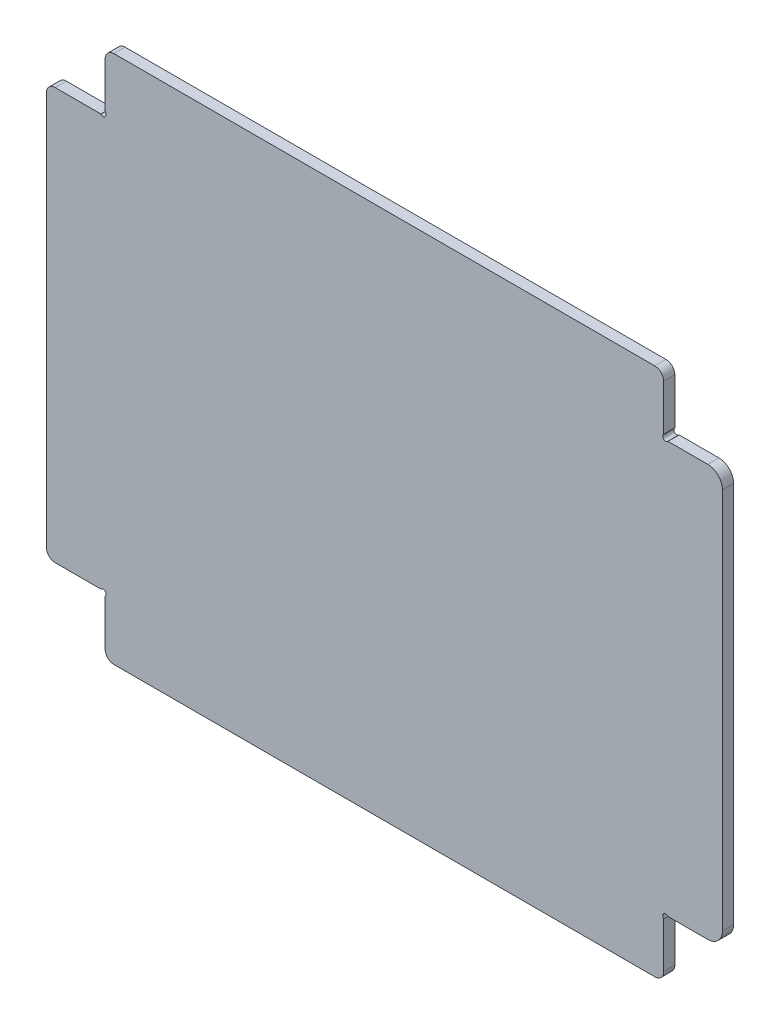
ISO-10303-21;
HEADER;
FILE_DESCRIPTION(('STEP AP214'),'2;1');
FILE_NAME('part.step','',(''),(''),'','','');
FILE_SCHEMA(('AUTOMOTIVE_DESIGN { 1 0 10303 214 1 1 1 1 }'));
ENDSEC;
DATA;
#1=APPLICATION_CONTEXT('core data for automotive mechanical design processes');
#2=APPLICATION_PROTOCOL_DEFINITION('international standard','automotive_design',2000,#1);
#3=PRODUCT_CONTEXT('',#1,'mechanical');
#4=PRODUCT('Part','Part','',(#3));
#5=PRODUCT_RELATED_PRODUCT_CATEGORY('part','',(#4));
#6=PRODUCT_DEFINITION_FORMATION('','',#4);
#7=PRODUCT_DEFINITION_CONTEXT('part definition',#1,'design');
#8=PRODUCT_DEFINITION('design','',#6,#7);
#9=PRODUCT_DEFINITION_SHAPE('','',#8);
#10=(LENGTH_UNIT() NAMED_UNIT(*) SI_UNIT(.MILLI.,.METRE.));
#11=(NAMED_UNIT(*) PLANE_ANGLE_UNIT() SI_UNIT($,.RADIAN.));
#12=(NAMED_UNIT(*) SI_UNIT($,.STERADIAN.) SOLID_ANGLE_UNIT());
#13=UNCERTAINTY_MEASURE_WITH_UNIT(LENGTH_MEASURE(1.E-05),#10,'distance_accuracy_value','');
#14=(GEOMETRIC_REPRESENTATION_CONTEXT(3) GLOBAL_UNCERTAINTY_ASSIGNED_CONTEXT((#13)) GLOBAL_UNIT_ASSIGNED_CONTEXT((#10,
#11,#12)) REPRESENTATION_CONTEXT('',''));
#15=CARTESIAN_POINT('',(0.,0.,0.));
#16=DIRECTION('',(0.,0.,1.));
#17=DIRECTION('',(1.,0.,0.));
#18=AXIS2_PLACEMENT_3D('',#15,#16,#17);
#19=CARTESIAN_POINT('',(-138.752131357152,-64.6460630618817,3.8));
#20=DIRECTION('',(0.,0.,-1.));
#21=DIRECTION('',(-1.,0.,0.));
#22=AXIS2_PLACEMENT_3D('',#19,#20,#21);
#23=CYLINDRICAL_SURFACE('',#22,3.);
#24=CARTESIAN_POINT('',(-138.752131357152,-64.6460630618817,0.));
#25=DIRECTION('',(0.,0.,1.));
#26=DIRECTION('',(1.,0.,0.));
#27=AXIS2_PLACEMENT_3D('',#24,#25,#26);
#28=CIRCLE('',#27,3.);
#29=CARTESIAN_POINT('',(-141.752131357152,-64.6460630618817,0.));
#30=VERTEX_POINT('',#29);
#31=CARTESIAN_POINT('',(-138.752131357152,-67.6460630618816,0.));
#32=VERTEX_POINT('',#31);
#33=EDGE_CURVE('E229',#30,#32,#28,.T.);
#34=ORIENTED_EDGE('',*,*,#33,.T.);
#35=DIRECTION('',(0.,0.,-1.));
#36=VECTOR('',#35,1.);
#37=CARTESIAN_POINT('',(-138.752131357152,-67.6460630618816,3.8));
#38=LINE('',#37,#36);
#39=CARTESIAN_POINT('',(-138.752131357152,-67.6460630618816,3.8));
#40=VERTEX_POINT('',#39);
#41=EDGE_CURVE('E11',#40,#32,#38,.T.);
#42=ORIENTED_EDGE('',*,*,#41,.F.);
#43=CARTESIAN_POINT('',(-138.752131357152,-64.6460630618817,3.8));
#44=DIRECTION('',(0.,0.,1.));
#45=DIRECTION('',(1.,0.,0.));
#46=AXIS2_PLACEMENT_3D('',#43,#44,#45);
#47=CIRCLE('',#46,3.);
#48=CARTESIAN_POINT('',(-141.752131357152,-64.6460630618817,3.8));
#49=VERTEX_POINT('',#48);
#50=EDGE_CURVE('E275',#49,#40,#47,.T.);
#51=ORIENTED_EDGE('',*,*,#50,.F.);
#52=DIRECTION('',(0.,0.,-1.));
#53=VECTOR('',#52,1.);
#54=CARTESIAN_POINT('',(-141.752131357152,-64.6460630618817,3.8));
#55=LINE('',#54,#53);
#56=EDGE_CURVE('E225',#49,#30,#55,.T.);
#57=ORIENTED_EDGE('',*,*,#56,.T.);
#58=EDGE_LOOP('',(#34,#42,#51,#57));
#59=FACE_BOUND('',#58,.T.);
#60=ADVANCED_FACE('F37',(#59),#23,.T.);
#61=CARTESIAN_POINT('',(-138.752131357152,-67.6460630618816,3.8));
#62=DIRECTION('',(0.,1.,0.));
#63=DIRECTION('',(0.,0.,1.));
#64=AXIS2_PLACEMENT_3D('',#61,#62,#63);
#65=PLANE('',#64);
#66=DIRECTION('',(1.,0.,0.));
#67=VECTOR('',#66,1.);
#68=CARTESIAN_POINT('',(-138.752131357152,-67.6460630618816,0.));
#69=LINE('',#68,#67);
#70=CARTESIAN_POINT('',(45.2478686428469,-67.6460630618817,0.));
#71=VERTEX_POINT('',#70);
#72=EDGE_CURVE('E232',#32,#71,#69,.T.);
#73=ORIENTED_EDGE('',*,*,#72,.T.);
#74=DIRECTION('',(0.,0.,-1.));
#75=VECTOR('',#74,1.);
#76=CARTESIAN_POINT('',(45.2478686428469,-67.6460630618817,3.8));
#77=LINE('',#76,#75);
#78=CARTESIAN_POINT('',(45.2478686428469,-67.6460630618817,3.8));
#79=VERTEX_POINT('',#78);
#80=EDGE_CURVE('E45',#79,#71,#77,.T.);
#81=ORIENTED_EDGE('',*,*,#80,.F.);
#82=DIRECTION('',(1.,0.,0.));
#83=VECTOR('',#82,1.);
#84=CARTESIAN_POINT('',(-138.752131357152,-67.6460630618816,3.8));
#85=LINE('',#84,#83);
#86=EDGE_CURVE('E144',#40,#79,#85,.T.);
#87=ORIENTED_EDGE('',*,*,#86,.F.);
#88=ORIENTED_EDGE('',*,*,#41,.T.);
#89=EDGE_LOOP('',(#73,#81,#87,#88));
#90=FACE_BOUND('',#89,.T.);
#91=ADVANCED_FACE('F413',(#90),#65,.F.);
#92=CARTESIAN_POINT('',(45.2478686428469,-64.6460630618817,3.8));
#93=DIRECTION('',(0.,0.,-1.));
#94=DIRECTION('',(-1.,0.,0.));
#95=AXIS2_PLACEMENT_3D('',#92,#93,#94);
#96=CYLINDRICAL_SURFACE('',#95,2.99999999999999);
#97=CARTESIAN_POINT('',(45.2478686428469,-64.6460630618817,0.));
#98=DIRECTION('',(0.,0.,1.));
#99=DIRECTION('',(-1.,0.,0.));
#100=AXIS2_PLACEMENT_3D('',#97,#98,#99);
#101=CIRCLE('',#100,2.99999999999999);
#102=CARTESIAN_POINT('',(48.2478686428469,-64.646063061881,0.));
#103=VERTEX_POINT('',#102);
#104=EDGE_CURVE('E234',#71,#103,#101,.T.);
#105=ORIENTED_EDGE('',*,*,#104,.T.);
#106=DIRECTION('',(0.,0.,-1.));
#107=VECTOR('',#106,1.);
#108=CARTESIAN_POINT('',(48.2478686428469,-64.646063061881,3.8));
#109=LINE('',#108,#107);
#110=CARTESIAN_POINT('',(48.2478686428469,-64.646063061881,3.8));
#111=VERTEX_POINT('',#110);
#112=EDGE_CURVE('E330',#111,#103,#109,.T.);
#113=ORIENTED_EDGE('',*,*,#112,.F.);
#114=CARTESIAN_POINT('',(45.2478686428469,-64.6460630618817,3.8));
#115=DIRECTION('',(0.,0.,1.));
#116=DIRECTION('',(-1.,0.,0.));
#117=AXIS2_PLACEMENT_3D('',#114,#115,#116);
#118=CIRCLE('',#117,2.99999999999999);
#119=EDGE_CURVE('E338',#79,#111,#118,.T.);
#120=ORIENTED_EDGE('',*,*,#119,.F.);
#121=ORIENTED_EDGE('',*,*,#80,.T.);
#122=EDGE_LOOP('',(#105,#113,#120,#121));
#123=FACE_BOUND('',#122,.T.);
#124=ADVANCED_FACE('F336',(#123),#96,.T.);
#125=CARTESIAN_POINT('',(48.2478686428469,-64.646063061881,3.8));
#126=DIRECTION('',(-1.,0.,0.));
#127=DIRECTION('',(0.,-1.,0.));
#128=AXIS2_PLACEMENT_3D('',#125,#126,#127);
#129=PLANE('',#128);
#130=DIRECTION('',(0.,1.,0.));
#131=VECTOR('',#130,1.);
#132=CARTESIAN_POINT('',(48.2478686428469,-64.646063061881,0.));
#133=LINE('',#132,#131);
#134=CARTESIAN_POINT('',(48.2478686428477,-49.003362395173,0.));
#135=VERTEX_POINT('',#134);
#136=EDGE_CURVE('E236',#103,#135,#133,.T.);
#137=ORIENTED_EDGE('',*,*,#136,.T.);
#138=DIRECTION('',(0.,0.,-1.));
#139=VECTOR('',#138,1.);
#140=CARTESIAN_POINT('',(48.2478686428477,-49.003362395173,3.8));
#141=LINE('',#140,#139);
#142=CARTESIAN_POINT('',(48.2478686428477,-49.003362395173,3.8));
#143=VERTEX_POINT('',#142);
#144=EDGE_CURVE('E327',#143,#135,#141,.T.);
#145=ORIENTED_EDGE('',*,*,#144,.F.);
#146=DIRECTION('',(0.,1.,0.));
#147=VECTOR('',#146,1.);
#148=CARTESIAN_POINT('',(48.2478686428469,-64.646063061881,3.8));
#149=LINE('',#148,#147);
#150=EDGE_CURVE('E356',#111,#143,#149,.T.);
#151=ORIENTED_EDGE('',*,*,#150,.F.);
#152=ORIENTED_EDGE('',*,*,#112,.T.);
#153=EDGE_LOOP('',(#137,#145,#151,#152));
#154=FACE_BOUND('',#153,.T.);
#155=ADVANCED_FACE('F347',(#154),#129,.F.);
#156=CARTESIAN_POINT('',(48.9411700787697,-48.2827146872401,3.8));
#157=DIRECTION('',(0.,0.,-1.));
#158=DIRECTION('',(-1.,0.,0.));
#159=AXIS2_PLACEMENT_3D('',#156,#157,#158);
#160=CYLINDRICAL_SURFACE('',#159,1.00000000000018);
#161=CARTESIAN_POINT('',(48.9411700787697,-48.2827146872401,0.));
#162=DIRECTION('',(0.,0.,-1.));
#163=DIRECTION('',(1.,0.,0.));
#164=AXIS2_PLACEMENT_3D('',#161,#162,#163);
#165=CIRCLE('',#164,1.00000000000018);
#166=CARTESIAN_POINT('',(49.7123216254531,-47.6460630619004,0.));
#167=VERTEX_POINT('',#166);
#168=EDGE_CURVE('E238',#135,#167,#165,.T.);
#169=ORIENTED_EDGE('',*,*,#168,.T.);
#170=DIRECTION('',(0.,0.,-1.));
#171=VECTOR('',#170,1.);
#172=CARTESIAN_POINT('',(49.7123216254531,-47.6460630619004,3.8));
#173=LINE('',#172,#171);
#174=CARTESIAN_POINT('',(49.7123216254531,-47.6460630619004,3.8));
#175=VERTEX_POINT('',#174);
#176=EDGE_CURVE('E324',#175,#167,#173,.T.);
#177=ORIENTED_EDGE('',*,*,#176,.F.);
#178=CARTESIAN_POINT('',(48.9411700787697,-48.2827146872401,3.8));
#179=DIRECTION('',(0.,0.,-1.));
#180=DIRECTION('',(1.,0.,0.));
#181=AXIS2_PLACEMENT_3D('',#178,#179,#180);
#182=CIRCLE('',#181,1.00000000000018);
#183=EDGE_CURVE('E353',#143,#175,#182,.T.);
#184=ORIENTED_EDGE('',*,*,#183,.F.);
#185=ORIENTED_EDGE('',*,*,#144,.T.);
#186=EDGE_LOOP('',(#169,#177,#184,#185));
#187=FACE_BOUND('',#186,.T.);
#188=ADVANCED_FACE('F351',(#187),#160,.F.);
#189=CARTESIAN_POINT('',(63.2478686428475,-47.6460630619004,3.8));
#190=DIRECTION('',(0.,1.,0.));
#191=DIRECTION('',(0.,0.,1.));
#192=AXIS2_PLACEMENT_3D('',#189,#190,#191);
#193=PLANE('',#192);
#194=DIRECTION('',(1.,0.,0.));
#195=VECTOR('',#194,1.);
#196=CARTESIAN_POINT('',(63.2478686428475,-47.6460630619004,0.));
#197=LINE('',#196,#195);
#198=CARTESIAN_POINT('',(63.2478686428475,-47.6460630619004,0.));
#199=VERTEX_POINT('',#198);
#200=EDGE_CURVE('E240',#167,#199,#197,.T.);
#201=ORIENTED_EDGE('',*,*,#200,.T.);
#202=DIRECTION('',(0.,0.,-1.));
#203=VECTOR('',#202,1.);
#204=CARTESIAN_POINT('',(63.2478686428475,-47.6460630619004,3.8));
#205=LINE('',#204,#203);
#206=CARTESIAN_POINT('',(63.2478686428475,-47.6460630619004,3.8));
#207=VERTEX_POINT('',#206);
#208=EDGE_CURVE('E321',#207,#199,#205,.T.);
#209=ORIENTED_EDGE('',*,*,#208,.F.);
#210=DIRECTION('',(1.,0.,0.));
#211=VECTOR('',#210,1.);
#212=CARTESIAN_POINT('',(63.2478686428475,-47.6460630619004,3.8));
#213=LINE('',#212,#211);
#214=EDGE_CURVE('E355',#175,#207,#213,.T.);
#215=ORIENTED_EDGE('',*,*,#214,.F.);
#216=ORIENTED_EDGE('',*,*,#176,.T.);
#217=EDGE_LOOP('',(#201,#209,#215,#216));
#218=FACE_BOUND('',#217,.T.);
#219=ADVANCED_FACE('F426',(#218),#193,.F.);
#220=CARTESIAN_POINT('',(63.2478686428476,-42.6460630619004,3.8));
#221=DIRECTION('',(0.,0.,-1.));
#222=DIRECTION('',(-1.,0.,0.));
#223=AXIS2_PLACEMENT_3D('',#220,#221,#222);
#224=CYLINDRICAL_SURFACE('',#223,5.);
#225=CARTESIAN_POINT('',(63.2478686428476,-42.6460630619004,0.));
#226=DIRECTION('',(0.,0.,1.));
#227=DIRECTION('',(-1.,0.,0.));
#228=AXIS2_PLACEMENT_3D('',#225,#226,#227);
#229=CIRCLE('',#228,5.);
#230=CARTESIAN_POINT('',(68.2478686428476,-42.6460630619004,0.));
#231=VERTEX_POINT('',#230);
#232=EDGE_CURVE('E242',#199,#231,#229,.T.);
#233=ORIENTED_EDGE('',*,*,#232,.T.);
#234=DIRECTION('',(0.,0.,-1.));
#235=VECTOR('',#234,1.);
#236=CARTESIAN_POINT('',(68.2478686428476,-42.6460630619004,3.8));
#237=LINE('',#236,#235);
#238=CARTESIAN_POINT('',(68.2478686428476,-42.6460630619004,3.8));
#239=VERTEX_POINT('',#238);
#240=EDGE_CURVE('E318',#239,#231,#237,.T.);
#241=ORIENTED_EDGE('',*,*,#240,.F.);
#242=CARTESIAN_POINT('',(63.2478686428476,-42.6460630619004,3.8));
#243=DIRECTION('',(0.,0.,1.));
#244=DIRECTION('',(-1.,0.,0.));
#245=AXIS2_PLACEMENT_3D('',#242,#243,#244);
#246=CIRCLE('',#245,5.);
#247=EDGE_CURVE('E358',#207,#239,#246,.T.);
#248=ORIENTED_EDGE('',*,*,#247,.F.);
#249=ORIENTED_EDGE('',*,*,#208,.T.);
#250=EDGE_LOOP('',(#233,#241,#248,#249));
#251=FACE_BOUND('',#250,.T.);
#252=ADVANCED_FACE('F429',(#251),#224,.T.);
#253=CARTESIAN_POINT('',(68.2478686428476,87.353936938137,3.8));
#254=DIRECTION('',(-1.,0.,0.));
#255=DIRECTION('',(0.,0.,1.));
#256=AXIS2_PLACEMENT_3D('',#253,#254,#255);
#257=PLANE('',#256);
#258=DIRECTION('',(0.,1.,0.));
#259=VECTOR('',#258,1.);
#260=CARTESIAN_POINT('',(68.2478686428476,87.353936938137,0.));
#261=LINE('',#260,#259);
#262=CARTESIAN_POINT('',(68.2478686428476,87.353936938137,0.));
#263=VERTEX_POINT('',#262);
#264=EDGE_CURVE('E244',#231,#263,#261,.T.);
#265=ORIENTED_EDGE('',*,*,#264,.T.);
#266=DIRECTION('',(0.,0.,-1.));
#267=VECTOR('',#266,1.);
#268=CARTESIAN_POINT('',(68.2478686428476,87.353936938137,3.8));
#269=LINE('',#268,#267);
#270=CARTESIAN_POINT('',(68.2478686428476,87.353936938137,3.8));
#271=VERTEX_POINT('',#270);
#272=EDGE_CURVE('E315',#271,#263,#269,.T.);
#273=ORIENTED_EDGE('',*,*,#272,.F.);
#274=DIRECTION('',(0.,1.,0.));
#275=VECTOR('',#274,1.);
#276=CARTESIAN_POINT('',(68.2478686428476,87.353936938137,3.8));
#277=LINE('',#276,#275);
#278=EDGE_CURVE('E364',#239,#271,#277,.T.);
#279=ORIENTED_EDGE('',*,*,#278,.F.);
#280=ORIENTED_EDGE('',*,*,#240,.T.);
#281=EDGE_LOOP('',(#265,#273,#279,#280));
#282=FACE_BOUND('',#281,.T.);
#283=ADVANCED_FACE('F433',(#282),#257,.F.);
#284=CARTESIAN_POINT('',(63.2478686428476,87.3539369381371,3.8));
#285=DIRECTION('',(0.,0.,-1.));
#286=DIRECTION('',(-1.,0.,0.));
#287=AXIS2_PLACEMENT_3D('',#284,#285,#286);
#288=CYLINDRICAL_SURFACE('',#287,5.);
#289=CARTESIAN_POINT('',(63.2478686428476,87.3539369381371,0.));
#290=DIRECTION('',(0.,0.,1.));
#291=DIRECTION('',(1.,0.,0.));
#292=AXIS2_PLACEMENT_3D('',#289,#290,#291);
#293=CIRCLE('',#292,5.);
#294=CARTESIAN_POINT('',(63.2478686428475,92.3539369381371,0.));
#295=VERTEX_POINT('',#294);
#296=EDGE_CURVE('E246',#263,#295,#293,.T.);
#297=ORIENTED_EDGE('',*,*,#296,.T.);
#298=DIRECTION('',(0.,0.,-1.));
#299=VECTOR('',#298,1.);
#300=CARTESIAN_POINT('',(63.2478686428475,92.3539369381371,3.8));
#301=LINE('',#300,#299);
#302=CARTESIAN_POINT('',(63.2478686428475,92.3539369381371,3.8));
#303=VERTEX_POINT('',#302);
#304=EDGE_CURVE('E312',#303,#295,#301,.T.);
#305=ORIENTED_EDGE('',*,*,#304,.F.);
#306=CARTESIAN_POINT('',(63.2478686428476,87.3539369381371,3.8));
#307=DIRECTION('',(0.,0.,1.));
#308=DIRECTION('',(1.,0.,0.));
#309=AXIS2_PLACEMENT_3D('',#306,#307,#308);
#310=CIRCLE('',#309,5.);
#311=EDGE_CURVE('E366',#271,#303,#310,.T.);
#312=ORIENTED_EDGE('',*,*,#311,.F.);
#313=ORIENTED_EDGE('',*,*,#272,.T.);
#314=EDGE_LOOP('',(#297,#305,#312,#313));
#315=FACE_BOUND('',#314,.T.);
#316=ADVANCED_FACE('F437',(#315),#288,.T.);
#317=CARTESIAN_POINT('',(63.2478686428475,92.3539369381371,3.8));
#318=DIRECTION('',(0.,-1.,0.));
#319=DIRECTION('',(0.,0.,-1.));
#320=AXIS2_PLACEMENT_3D('',#317,#318,#319);
#321=PLANE('',#320);
#322=DIRECTION('',(-1.,0.,0.));
#323=VECTOR('',#322,1.);
#324=CARTESIAN_POINT('',(63.2478686428475,92.3539369381371,0.));
#325=LINE('',#324,#323);
#326=CARTESIAN_POINT('',(49.7123216254533,92.353936938137,0.));
#327=VERTEX_POINT('',#326);
#328=EDGE_CURVE('E248',#295,#327,#325,.T.);
#329=ORIENTED_EDGE('',*,*,#328,.T.);
#330=DIRECTION('',(0.,0.,-1.));
#331=VECTOR('',#330,1.);
#332=CARTESIAN_POINT('',(49.7123216254533,92.353936938137,3.8));
#333=LINE('',#332,#331);
#334=CARTESIAN_POINT('',(49.7123216254533,92.353936938137,3.8));
#335=VERTEX_POINT('',#334);
#336=EDGE_CURVE('E309',#335,#327,#333,.T.);
#337=ORIENTED_EDGE('',*,*,#336,.F.);
#338=DIRECTION('',(-1.,0.,0.));
#339=VECTOR('',#338,1.);
#340=CARTESIAN_POINT('',(63.2478686428475,92.3539369381371,3.8));
#341=LINE('',#340,#339);
#342=EDGE_CURVE('E368',#303,#335,#341,.T.);
#343=ORIENTED_EDGE('',*,*,#342,.F.);
#344=ORIENTED_EDGE('',*,*,#304,.T.);
#345=EDGE_LOOP('',(#329,#337,#343,#344));
#346=FACE_BOUND('',#345,.T.);
#347=ADVANCED_FACE('F441',(#346),#321,.F.);
#348=CARTESIAN_POINT('',(48.9411700787697,92.9905885634768,3.8));
#349=DIRECTION('',(0.,0.,-1.));
#350=DIRECTION('',(-1.,0.,0.));
#351=AXIS2_PLACEMENT_3D('',#348,#349,#350);
#352=CYLINDRICAL_SURFACE('',#351,1.00000000000018);
#353=CARTESIAN_POINT('',(48.9411700787697,92.9905885634768,0.));
#354=DIRECTION('',(0.,0.,-1.));
#355=DIRECTION('',(-1.,0.,0.));
#356=AXIS2_PLACEMENT_3D('',#353,#354,#355);
#357=CIRCLE('',#356,1.00000000000018);
#358=CARTESIAN_POINT('',(48.2478686428476,93.7112362714098,0.));
#359=VERTEX_POINT('',#358);
#360=EDGE_CURVE('E250',#327,#359,#357,.T.);
#361=ORIENTED_EDGE('',*,*,#360,.T.);
#362=DIRECTION('',(0.,0.,-1.));
#363=VECTOR('',#362,1.);
#364=CARTESIAN_POINT('',(48.2478686428476,93.7112362714098,3.8));
#365=LINE('',#364,#363);
#366=CARTESIAN_POINT('',(48.2478686428476,93.7112362714098,3.8));
#367=VERTEX_POINT('',#366);
#368=EDGE_CURVE('E306',#367,#359,#365,.T.);
#369=ORIENTED_EDGE('',*,*,#368,.F.);
#370=CARTESIAN_POINT('',(48.9411700787697,92.9905885634768,3.8));
#371=DIRECTION('',(0.,0.,-1.));
#372=DIRECTION('',(-1.,0.,0.));
#373=AXIS2_PLACEMENT_3D('',#370,#371,#372);
#374=CIRCLE('',#373,1.00000000000018);
#375=EDGE_CURVE('E370',#335,#367,#374,.T.);
#376=ORIENTED_EDGE('',*,*,#375,.F.);
#377=ORIENTED_EDGE('',*,*,#336,.T.);
#378=EDGE_LOOP('',(#361,#369,#376,#377));
#379=FACE_BOUND('',#378,.T.);
#380=ADVANCED_FACE('F445',(#379),#352,.F.);
#381=CARTESIAN_POINT('',(48.2478686428476,109.353936938118,3.8));
#382=DIRECTION('',(-1.,0.,0.));
#383=DIRECTION('',(0.,0.,1.));
#384=AXIS2_PLACEMENT_3D('',#381,#382,#383);
#385=PLANE('',#384);
#386=DIRECTION('',(0.,1.,0.));
#387=VECTOR('',#386,1.);
#388=CARTESIAN_POINT('',(48.2478686428476,109.353936938118,0.));
#389=LINE('',#388,#387);
#390=CARTESIAN_POINT('',(48.2478686428476,109.353936938118,0.));
#391=VERTEX_POINT('',#390);
#392=EDGE_CURVE('E252',#359,#391,#389,.T.);
#393=ORIENTED_EDGE('',*,*,#392,.T.);
#394=DIRECTION('',(0.,0.,-1.));
#395=VECTOR('',#394,1.);
#396=CARTESIAN_POINT('',(48.2478686428476,109.353936938118,3.8));
#397=LINE('',#396,#395);
#398=CARTESIAN_POINT('',(48.2478686428476,109.353936938118,3.8));
#399=VERTEX_POINT('',#398);
#400=EDGE_CURVE('E303',#399,#391,#397,.T.);
#401=ORIENTED_EDGE('',*,*,#400,.F.);
#402=DIRECTION('',(0.,1.,0.));
#403=VECTOR('',#402,1.);
#404=CARTESIAN_POINT('',(48.2478686428476,109.353936938118,3.8));
#405=LINE('',#404,#403);
#406=EDGE_CURVE('E372',#367,#399,#405,.T.);
#407=ORIENTED_EDGE('',*,*,#406,.F.);
#408=ORIENTED_EDGE('',*,*,#368,.T.);
#409=EDGE_LOOP('',(#393,#401,#407,#408));
#410=FACE_BOUND('',#409,.T.);
#411=ADVANCED_FACE('F449',(#410),#385,.F.);
#412=CARTESIAN_POINT('',(45.2478686428476,109.353936938118,3.8));
#413=DIRECTION('',(0.,0.,-1.));
#414=DIRECTION('',(-1.,0.,0.));
#415=AXIS2_PLACEMENT_3D('',#412,#413,#414);
#416=CYLINDRICAL_SURFACE('',#415,3.);
#417=CARTESIAN_POINT('',(45.2478686428476,109.353936938118,0.));
#418=DIRECTION('',(0.,0.,1.));
#419=DIRECTION('',(1.,0.,0.));
#420=AXIS2_PLACEMENT_3D('',#417,#418,#419);
#421=CIRCLE('',#420,3.);
#422=CARTESIAN_POINT('',(45.2478686428476,112.353936938118,0.));
#423=VERTEX_POINT('',#422);
#424=EDGE_CURVE('E254',#391,#423,#421,.T.);
#425=ORIENTED_EDGE('',*,*,#424,.T.);
#426=DIRECTION('',(0.,0.,-1.));
#427=VECTOR('',#426,1.);
#428=CARTESIAN_POINT('',(45.2478686428476,112.353936938118,3.8));
#429=LINE('',#428,#427);
#430=CARTESIAN_POINT('',(45.2478686428476,112.353936938118,3.8));
#431=VERTEX_POINT('',#430);
#432=EDGE_CURVE('E300',#431,#423,#429,.T.);
#433=ORIENTED_EDGE('',*,*,#432,.F.);
#434=CARTESIAN_POINT('',(45.2478686428476,109.353936938118,3.8));
#435=DIRECTION('',(0.,0.,1.));
#436=DIRECTION('',(1.,0.,0.));
#437=AXIS2_PLACEMENT_3D('',#434,#435,#436);
#438=CIRCLE('',#437,3.);
#439=EDGE_CURVE('E374',#399,#431,#438,.T.);
#440=ORIENTED_EDGE('',*,*,#439,.F.);
#441=ORIENTED_EDGE('',*,*,#400,.T.);
#442=EDGE_LOOP('',(#425,#433,#440,#441));
#443=FACE_BOUND('',#442,.T.);
#444=ADVANCED_FACE('F453',(#443),#416,.T.);
#445=CARTESIAN_POINT('',(-138.752131357152,112.353936938118,3.8));
#446=DIRECTION('',(0.,-1.,0.));
#447=DIRECTION('',(0.,0.,-1.));
#448=AXIS2_PLACEMENT_3D('',#445,#446,#447);
#449=PLANE('',#448);
#450=DIRECTION('',(-1.,0.,0.));
#451=VECTOR('',#450,1.);
#452=CARTESIAN_POINT('',(-138.752131357152,112.353936938118,0.));
#453=LINE('',#452,#451);
#454=CARTESIAN_POINT('',(-138.752131357152,112.353936938118,0.));
#455=VERTEX_POINT('',#454);
#456=EDGE_CURVE('E256',#423,#455,#453,.T.);
#457=ORIENTED_EDGE('',*,*,#456,.T.);
#458=DIRECTION('',(0.,0.,-1.));
#459=VECTOR('',#458,1.);
#460=CARTESIAN_POINT('',(-138.752131357152,112.353936938118,3.8));
#461=LINE('',#460,#459);
#462=CARTESIAN_POINT('',(-138.752131357152,112.353936938118,3.8));
#463=VERTEX_POINT('',#462);
#464=EDGE_CURVE('E297',#463,#455,#461,.T.);
#465=ORIENTED_EDGE('',*,*,#464,.F.);
#466=DIRECTION('',(-1.,0.,0.));
#467=VECTOR('',#466,1.);
#468=CARTESIAN_POINT('',(-138.752131357152,112.353936938118,3.8));
#469=LINE('',#468,#467);
#470=EDGE_CURVE('E376',#431,#463,#469,.T.);
#471=ORIENTED_EDGE('',*,*,#470,.F.);
#472=ORIENTED_EDGE('',*,*,#432,.T.);
#473=EDGE_LOOP('',(#457,#465,#471,#472));
#474=FACE_BOUND('',#473,.T.);
#475=ADVANCED_FACE('F457',(#474),#449,.F.);
#476=CARTESIAN_POINT('',(-138.752131357152,109.353936938118,3.8));
#477=DIRECTION('',(0.,0.,-1.));
#478=DIRECTION('',(-1.,0.,0.));
#479=AXIS2_PLACEMENT_3D('',#476,#477,#478);
#480=CYLINDRICAL_SURFACE('',#479,3.);
#481=CARTESIAN_POINT('',(-138.752131357152,109.353936938118,0.));
#482=DIRECTION('',(0.,0.,1.));
#483=DIRECTION('',(-1.,0.,0.));
#484=AXIS2_PLACEMENT_3D('',#481,#482,#483);
#485=CIRCLE('',#484,3.);
#486=CARTESIAN_POINT('',(-141.752131357152,109.353936938118,0.));
#487=VERTEX_POINT('',#486);
#488=EDGE_CURVE('E258',#455,#487,#485,.T.);
#489=ORIENTED_EDGE('',*,*,#488,.T.);
#490=DIRECTION('',(0.,0.,-1.));
#491=VECTOR('',#490,1.);
#492=CARTESIAN_POINT('',(-141.752131357152,109.353936938118,3.8));
#493=LINE('',#492,#491);
#494=CARTESIAN_POINT('',(-141.752131357152,109.353936938118,3.8));
#495=VERTEX_POINT('',#494);
#496=EDGE_CURVE('E294',#495,#487,#493,.T.);
#497=ORIENTED_EDGE('',*,*,#496,.F.);
#498=CARTESIAN_POINT('',(-138.752131357152,109.353936938118,3.8));
#499=DIRECTION('',(0.,0.,1.));
#500=DIRECTION('',(-1.,0.,0.));
#501=AXIS2_PLACEMENT_3D('',#498,#499,#500);
#502=CIRCLE('',#501,3.);
#503=EDGE_CURVE('E378',#463,#495,#502,.T.);
#504=ORIENTED_EDGE('',*,*,#503,.F.);
#505=ORIENTED_EDGE('',*,*,#464,.T.);
#506=EDGE_LOOP('',(#489,#497,#504,#505));
#507=FACE_BOUND('',#506,.T.);
#508=ADVANCED_FACE('F461',(#507),#480,.T.);
#509=CARTESIAN_POINT('',(-141.752131357152,109.353936938118,3.8));
#510=DIRECTION('',(1.,0.,0.));
#511=DIRECTION('',(0.,0.,-1.));
#512=AXIS2_PLACEMENT_3D('',#509,#510,#511);
#513=PLANE('',#512);
#514=DIRECTION('',(0.,-1.,0.));
#515=VECTOR('',#514,1.);
#516=CARTESIAN_POINT('',(-141.752131357152,109.353936938118,0.));
#517=LINE('',#516,#515);
#518=CARTESIAN_POINT('',(-141.752131357153,93.7112362714096,0.));
#519=VERTEX_POINT('',#518);
#520=EDGE_CURVE('E260',#487,#519,#517,.T.);
#521=ORIENTED_EDGE('',*,*,#520,.T.);
#522=DIRECTION('',(0.,0.,-1.));
#523=VECTOR('',#522,1.);
#524=CARTESIAN_POINT('',(-141.752131357153,93.7112362714096,3.8));
#525=LINE('',#524,#523);
#526=CARTESIAN_POINT('',(-141.752131357153,93.7112362714096,3.8));
#527=VERTEX_POINT('',#526);
#528=EDGE_CURVE('E291',#527,#519,#525,.T.);
#529=ORIENTED_EDGE('',*,*,#528,.F.);
#530=DIRECTION('',(0.,-1.,0.));
#531=VECTOR('',#530,1.);
#532=CARTESIAN_POINT('',(-141.752131357152,109.353936938118,3.8));
#533=LINE('',#532,#531);
#534=EDGE_CURVE('E380',#495,#527,#533,.T.);
#535=ORIENTED_EDGE('',*,*,#534,.F.);
#536=ORIENTED_EDGE('',*,*,#496,.T.);
#537=EDGE_LOOP('',(#521,#529,#535,#536));
#538=FACE_BOUND('',#537,.T.);
#539=ADVANCED_FACE('F465',(#538),#513,.F.);
#540=CARTESIAN_POINT('',(-142.445432793074,92.9905885634768,3.8));
#541=DIRECTION('',(0.,0.,-1.));
#542=DIRECTION('',(-1.,0.,0.));
#543=AXIS2_PLACEMENT_3D('',#540,#541,#542);
#544=CYLINDRICAL_SURFACE('',#543,1.00000000000018);
#545=CARTESIAN_POINT('',(-142.445432793074,92.9905885634768,0.));
#546=DIRECTION('',(0.,0.,-1.));
#547=DIRECTION('',(1.,0.,0.));
#548=AXIS2_PLACEMENT_3D('',#545,#546,#547);
#549=CIRCLE('',#548,1.00000000000018);
#550=CARTESIAN_POINT('',(-143.216584339758,92.3539369381371,0.));
#551=VERTEX_POINT('',#550);
#552=EDGE_CURVE('E262',#519,#551,#549,.T.);
#553=ORIENTED_EDGE('',*,*,#552,.T.);
#554=DIRECTION('',(0.,0.,-1.));
#555=VECTOR('',#554,1.);
#556=CARTESIAN_POINT('',(-143.216584339758,92.3539369381371,3.8));
#557=LINE('',#556,#555);
#558=CARTESIAN_POINT('',(-143.216584339758,92.3539369381371,3.8));
#559=VERTEX_POINT('',#558);
#560=EDGE_CURVE('E288',#559,#551,#557,.T.);
#561=ORIENTED_EDGE('',*,*,#560,.F.);
#562=CARTESIAN_POINT('',(-142.445432793074,92.9905885634768,3.8));
#563=DIRECTION('',(0.,0.,-1.));
#564=DIRECTION('',(1.,0.,0.));
#565=AXIS2_PLACEMENT_3D('',#562,#563,#564);
#566=CIRCLE('',#565,1.00000000000018);
#567=EDGE_CURVE('E382',#527,#559,#566,.T.);
#568=ORIENTED_EDGE('',*,*,#567,.F.);
#569=ORIENTED_EDGE('',*,*,#528,.T.);
#570=EDGE_LOOP('',(#553,#561,#568,#569));
#571=FACE_BOUND('',#570,.T.);
#572=ADVANCED_FACE('F469',(#571),#544,.F.);
#573=CARTESIAN_POINT('',(-158.752131357152,92.3539369381371,3.8));
#574=DIRECTION('',(0.,-1.,0.));
#575=DIRECTION('',(0.,0.,-1.));
#576=AXIS2_PLACEMENT_3D('',#573,#574,#575);
#577=PLANE('',#576);
#578=DIRECTION('',(-1.,0.,0.));
#579=VECTOR('',#578,1.);
#580=CARTESIAN_POINT('',(-158.752131357152,92.3539369381371,0.));
#581=LINE('',#580,#579);
#582=CARTESIAN_POINT('',(-158.752131357152,92.3539369381371,0.));
#583=VERTEX_POINT('',#582);
#584=EDGE_CURVE('E264',#551,#583,#581,.T.);
#585=ORIENTED_EDGE('',*,*,#584,.T.);
#586=DIRECTION('',(0.,0.,-1.));
#587=VECTOR('',#586,1.);
#588=CARTESIAN_POINT('',(-158.752131357152,92.3539369381371,3.8));
#589=LINE('',#588,#587);
#590=CARTESIAN_POINT('',(-158.752131357152,92.3539369381371,3.8));
#591=VERTEX_POINT('',#590);
#592=EDGE_CURVE('E285',#591,#583,#589,.T.);
#593=ORIENTED_EDGE('',*,*,#592,.F.);
#594=DIRECTION('',(-1.,0.,0.));
#595=VECTOR('',#594,1.);
#596=CARTESIAN_POINT('',(-158.752131357152,92.3539369381371,3.8));
#597=LINE('',#596,#595);
#598=EDGE_CURVE('E384',#559,#591,#597,.T.);
#599=ORIENTED_EDGE('',*,*,#598,.F.);
#600=ORIENTED_EDGE('',*,*,#560,.T.);
#601=EDGE_LOOP('',(#585,#593,#599,#600));
#602=FACE_BOUND('',#601,.T.);
#603=ADVANCED_FACE('F473',(#602),#577,.F.);
#604=CARTESIAN_POINT('',(-158.752131357152,89.3539369381371,3.8));
#605=DIRECTION('',(0.,0.,-1.));
#606=DIRECTION('',(-1.,0.,0.));
#607=AXIS2_PLACEMENT_3D('',#604,#605,#606);
#608=CYLINDRICAL_SURFACE('',#607,2.99999999999999);
#609=CARTESIAN_POINT('',(-158.752131357152,89.3539369381371,0.));
#610=DIRECTION('',(0.,0.,1.));
#611=DIRECTION('',(1.,0.,0.));
#612=AXIS2_PLACEMENT_3D('',#609,#610,#611);
#613=CIRCLE('',#612,2.99999999999999);
#614=CARTESIAN_POINT('',(-161.752131357152,89.3539369381371,0.));
#615=VERTEX_POINT('',#614);
#616=EDGE_CURVE('E266',#583,#615,#613,.T.);
#617=ORIENTED_EDGE('',*,*,#616,.T.);
#618=DIRECTION('',(0.,0.,-1.));
#619=VECTOR('',#618,1.);
#620=CARTESIAN_POINT('',(-161.752131357152,89.3539369381371,3.8));
#621=LINE('',#620,#619);
#622=CARTESIAN_POINT('',(-161.752131357152,89.3539369381371,3.8));
#623=VERTEX_POINT('',#622);
#624=EDGE_CURVE('E282',#623,#615,#621,.T.);
#625=ORIENTED_EDGE('',*,*,#624,.F.);
#626=CARTESIAN_POINT('',(-158.752131357152,89.3539369381371,3.8));
#627=DIRECTION('',(0.,0.,1.));
#628=DIRECTION('',(1.,0.,0.));
#629=AXIS2_PLACEMENT_3D('',#626,#627,#628);
#630=CIRCLE('',#629,2.99999999999999);
#631=EDGE_CURVE('E386',#591,#623,#630,.T.);
#632=ORIENTED_EDGE('',*,*,#631,.F.);
#633=ORIENTED_EDGE('',*,*,#592,.T.);
#634=EDGE_LOOP('',(#617,#625,#632,#633));
#635=FACE_BOUND('',#634,.T.);
#636=ADVANCED_FACE('F477',(#635),#608,.T.);
#637=CARTESIAN_POINT('',(-161.752131357152,89.3539369381371,3.8));
#638=DIRECTION('',(1.,0.,0.));
#639=DIRECTION('',(0.,0.,-1.));
#640=AXIS2_PLACEMENT_3D('',#637,#638,#639);
#641=PLANE('',#640);
#642=DIRECTION('',(0.,-1.,0.));
#643=VECTOR('',#642,1.);
#644=CARTESIAN_POINT('',(-161.752131357152,89.3539369381371,0.));
#645=LINE('',#644,#643);
#646=CARTESIAN_POINT('',(-161.752131357152,-44.6460630619004,0.));
#647=VERTEX_POINT('',#646);
#648=EDGE_CURVE('E268',#615,#647,#645,.T.);
#649=ORIENTED_EDGE('',*,*,#648,.T.);
#650=DIRECTION('',(0.,0.,-1.));
#651=VECTOR('',#650,1.);
#652=CARTESIAN_POINT('',(-161.752131357152,-44.6460630619004,3.8));
#653=LINE('',#652,#651);
#654=CARTESIAN_POINT('',(-161.752131357152,-44.6460630619004,3.8));
#655=VERTEX_POINT('',#654);
#656=EDGE_CURVE('E279',#655,#647,#653,.T.);
#657=ORIENTED_EDGE('',*,*,#656,.F.);
#658=DIRECTION('',(0.,-1.,0.));
#659=VECTOR('',#658,1.);
#660=CARTESIAN_POINT('',(-161.752131357152,89.3539369381371,3.8));
#661=LINE('',#660,#659);
#662=EDGE_CURVE('E388',#623,#655,#661,.T.);
#663=ORIENTED_EDGE('',*,*,#662,.F.);
#664=ORIENTED_EDGE('',*,*,#624,.T.);
#665=EDGE_LOOP('',(#649,#657,#663,#664));
#666=FACE_BOUND('',#665,.T.);
#667=ADVANCED_FACE('F394',(#666),#641,.F.);
#668=CARTESIAN_POINT('',(-158.752131357152,-44.6460630619004,3.8));
#669=DIRECTION('',(0.,0.,-1.));
#670=DIRECTION('',(-1.,0.,0.));
#671=AXIS2_PLACEMENT_3D('',#668,#669,#670);
#672=CYLINDRICAL_SURFACE('',#671,2.99999999999999);
#673=CARTESIAN_POINT('',(-158.752131357152,-44.6460630619004,0.));
#674=DIRECTION('',(0.,0.,1.));
#675=DIRECTION('',(-1.,0.,0.));
#676=AXIS2_PLACEMENT_3D('',#673,#674,#675);
#677=CIRCLE('',#676,2.99999999999999);
#678=CARTESIAN_POINT('',(-158.752131357152,-47.6460630619004,0.));
#679=VERTEX_POINT('',#678);
#680=EDGE_CURVE('E270',#647,#679,#677,.T.);
#681=ORIENTED_EDGE('',*,*,#680,.T.);
#682=DIRECTION('',(0.,0.,-1.));
#683=VECTOR('',#682,1.);
#684=CARTESIAN_POINT('',(-158.752131357152,-47.6460630619004,3.8));
#685=LINE('',#684,#683);
#686=CARTESIAN_POINT('',(-158.752131357152,-47.6460630619004,3.8));
#687=VERTEX_POINT('',#686);
#688=EDGE_CURVE('E220',#687,#679,#685,.T.);
#689=ORIENTED_EDGE('',*,*,#688,.F.);
#690=CARTESIAN_POINT('',(-158.752131357152,-44.6460630619004,3.8));
#691=DIRECTION('',(0.,0.,1.));
#692=DIRECTION('',(-1.,0.,0.));
#693=AXIS2_PLACEMENT_3D('',#690,#691,#692);
#694=CIRCLE('',#693,2.99999999999999);
#695=EDGE_CURVE('E211',#655,#687,#694,.T.);
#696=ORIENTED_EDGE('',*,*,#695,.F.);
#697=ORIENTED_EDGE('',*,*,#656,.T.);
#698=EDGE_LOOP('',(#681,#689,#696,#697));
#699=FACE_BOUND('',#698,.T.);
#700=ADVANCED_FACE('F398',(#699),#672,.T.);
#701=CARTESIAN_POINT('',(-158.752131357152,-47.6460630619004,3.8));
#702=DIRECTION('',(0.,1.,0.));
#703=DIRECTION('',(0.,0.,1.));
#704=AXIS2_PLACEMENT_3D('',#701,#702,#703);
#705=PLANE('',#704);
#706=DIRECTION('',(1.,0.,0.));
#707=VECTOR('',#706,1.);
#708=CARTESIAN_POINT('',(-158.752131357152,-47.6460630619004,0.));
#709=LINE('',#708,#707);
#710=CARTESIAN_POINT('',(-143.216584339758,-47.6460630619003,0.));
#711=VERTEX_POINT('',#710);
#712=EDGE_CURVE('E219',#679,#711,#709,.T.);
#713=ORIENTED_EDGE('',*,*,#712,.T.);
#714=DIRECTION('',(0.,0.,-1.));
#715=VECTOR('',#714,1.);
#716=CARTESIAN_POINT('',(-143.216584339758,-47.6460630619003,3.8));
#717=LINE('',#716,#715);
#718=CARTESIAN_POINT('',(-143.216584339758,-47.6460630619003,3.8));
#719=VERTEX_POINT('',#718);
#720=EDGE_CURVE('E216',#719,#711,#717,.T.);
#721=ORIENTED_EDGE('',*,*,#720,.F.);
#722=DIRECTION('',(1.,0.,0.));
#723=VECTOR('',#722,1.);
#724=CARTESIAN_POINT('',(-158.752131357152,-47.6460630619004,3.8));
#725=LINE('',#724,#723);
#726=EDGE_CURVE('E205',#687,#719,#725,.T.);
#727=ORIENTED_EDGE('',*,*,#726,.F.);
#728=ORIENTED_EDGE('',*,*,#688,.T.);
#729=EDGE_LOOP('',(#713,#721,#727,#728));
#730=FACE_BOUND('',#729,.T.);
#731=ADVANCED_FACE('F217',(#730),#705,.F.);
#732=CARTESIAN_POINT('',(-142.445432793074,-48.2827146872401,3.8));
#733=DIRECTION('',(0.,0.,-1.));
#734=DIRECTION('',(-1.,0.,0.));
#735=AXIS2_PLACEMENT_3D('',#732,#733,#734);
#736=CYLINDRICAL_SURFACE('',#735,1.00000000000022);
#737=CARTESIAN_POINT('',(-142.445432793074,-48.2827146872401,0.));
#738=DIRECTION('',(0.,0.,-1.));
#739=DIRECTION('',(-1.,0.,0.));
#740=AXIS2_PLACEMENT_3D('',#737,#738,#739);
#741=CIRCLE('',#740,1.00000000000022);
#742=CARTESIAN_POINT('',(-141.752131357152,-49.0033623951731,0.));
#743=VERTEX_POINT('',#742);
#744=EDGE_CURVE('E130',#711,#743,#741,.T.);
#745=ORIENTED_EDGE('',*,*,#744,.T.);
#746=DIRECTION('',(0.,0.,-1.));
#747=VECTOR('',#746,1.);
#748=CARTESIAN_POINT('',(-141.752131357152,-49.0033623951731,3.8));
#749=LINE('',#748,#747);
#750=CARTESIAN_POINT('',(-141.752131357152,-49.0033623951731,3.8));
#751=VERTEX_POINT('',#750);
#752=EDGE_CURVE('E221',#751,#743,#749,.T.);
#753=ORIENTED_EDGE('',*,*,#752,.F.);
#754=CARTESIAN_POINT('',(-142.445432793074,-48.2827146872401,3.8));
#755=DIRECTION('',(0.,0.,-1.));
#756=DIRECTION('',(-1.,0.,0.));
#757=AXIS2_PLACEMENT_3D('',#754,#755,#756);
#758=CIRCLE('',#757,1.00000000000022);
#759=EDGE_CURVE('E209',#719,#751,#758,.T.);
#760=ORIENTED_EDGE('',*,*,#759,.F.);
#761=ORIENTED_EDGE('',*,*,#720,.T.);
#762=EDGE_LOOP('',(#745,#753,#760,#761));
#763=FACE_BOUND('',#762,.T.);
#764=ADVANCED_FACE('F223',(#763),#736,.F.);
#765=CARTESIAN_POINT('',(-141.752131357152,-64.6460630618817,3.8));
#766=DIRECTION('',(1.,0.,0.));
#767=DIRECTION('',(0.,1.,0.));
#768=AXIS2_PLACEMENT_3D('',#765,#766,#767);
#769=PLANE('',#768);
#770=DIRECTION('',(0.,-1.,0.));
#771=VECTOR('',#770,1.);
#772=CARTESIAN_POINT('',(-141.752131357152,-64.6460630618817,0.));
#773=LINE('',#772,#771);
#774=EDGE_CURVE('E136',#743,#30,#773,.T.);
#775=ORIENTED_EDGE('',*,*,#774,.T.);
#776=ORIENTED_EDGE('',*,*,#56,.F.);
#777=DIRECTION('',(0.,-1.,0.));
#778=VECTOR('',#777,1.);
#779=CARTESIAN_POINT('',(-141.752131357152,-64.6460630618817,3.8));
#780=LINE('',#779,#778);
#781=EDGE_CURVE('E53',#751,#49,#780,.T.);
#782=ORIENTED_EDGE('',*,*,#781,.F.);
#783=ORIENTED_EDGE('',*,*,#752,.T.);
#784=EDGE_LOOP('',(#775,#776,#782,#783));
#785=FACE_BOUND('',#784,.T.);
#786=ADVANCED_FACE('F402',(#785),#769,.F.);
#787=CARTESIAN_POINT('',(-138.752131357152,-64.6460630618817,3.8));
#788=DIRECTION('',(0.,0.,1.));
#789=DIRECTION('',(1.,0.,0.));
#790=AXIS2_PLACEMENT_3D('',#787,#788,#789);
#791=PLANE('',#790);
#792=ORIENTED_EDGE('',*,*,#50,.T.);
#793=ORIENTED_EDGE('',*,*,#86,.T.);
#794=ORIENTED_EDGE('',*,*,#119,.T.);
#795=ORIENTED_EDGE('',*,*,#150,.T.);
#796=ORIENTED_EDGE('',*,*,#183,.T.);
#797=ORIENTED_EDGE('',*,*,#214,.T.);
#798=ORIENTED_EDGE('',*,*,#247,.T.);
#799=ORIENTED_EDGE('',*,*,#278,.T.);
#800=ORIENTED_EDGE('',*,*,#311,.T.);
#801=ORIENTED_EDGE('',*,*,#342,.T.);
#802=ORIENTED_EDGE('',*,*,#375,.T.);
#803=ORIENTED_EDGE('',*,*,#406,.T.);
#804=ORIENTED_EDGE('',*,*,#439,.T.);
#805=ORIENTED_EDGE('',*,*,#470,.T.);
#806=ORIENTED_EDGE('',*,*,#503,.T.);
#807=ORIENTED_EDGE('',*,*,#534,.T.);
#808=ORIENTED_EDGE('',*,*,#567,.T.);
#809=ORIENTED_EDGE('',*,*,#598,.T.);
#810=ORIENTED_EDGE('',*,*,#631,.T.);
#811=ORIENTED_EDGE('',*,*,#662,.T.);
#812=ORIENTED_EDGE('',*,*,#695,.T.);
#813=ORIENTED_EDGE('',*,*,#726,.T.);
#814=ORIENTED_EDGE('',*,*,#759,.T.);
#815=ORIENTED_EDGE('',*,*,#781,.T.);
#816=EDGE_LOOP('',(#792,#793,#794,#795,#796,#797,#798,#799,#800,#801,#802,#803,#804,#805,#806,
#807,#808,#809,#810,#811,#812,#813,#814,#815));
#817=FACE_BOUND('',#816,.T.);
#818=ADVANCED_FACE('F207',(#817),#791,.T.);
#819=CARTESIAN_POINT('',(-138.752131357152,-64.6460630618817,0.));
#820=DIRECTION('',(0.,0.,1.));
#821=DIRECTION('',(1.,0.,0.));
#822=AXIS2_PLACEMENT_3D('',#819,#820,#821);
#823=PLANE('',#822);
#824=ORIENTED_EDGE('',*,*,#33,.F.);
#825=ORIENTED_EDGE('',*,*,#774,.F.);
#826=ORIENTED_EDGE('',*,*,#744,.F.);
#827=ORIENTED_EDGE('',*,*,#712,.F.);
#828=ORIENTED_EDGE('',*,*,#680,.F.);
#829=ORIENTED_EDGE('',*,*,#648,.F.);
#830=ORIENTED_EDGE('',*,*,#616,.F.);
#831=ORIENTED_EDGE('',*,*,#584,.F.);
#832=ORIENTED_EDGE('',*,*,#552,.F.);
#833=ORIENTED_EDGE('',*,*,#520,.F.);
#834=ORIENTED_EDGE('',*,*,#488,.F.);
#835=ORIENTED_EDGE('',*,*,#456,.F.);
#836=ORIENTED_EDGE('',*,*,#424,.F.);
#837=ORIENTED_EDGE('',*,*,#392,.F.);
#838=ORIENTED_EDGE('',*,*,#360,.F.);
#839=ORIENTED_EDGE('',*,*,#328,.F.);
#840=ORIENTED_EDGE('',*,*,#296,.F.);
#841=ORIENTED_EDGE('',*,*,#264,.F.);
#842=ORIENTED_EDGE('',*,*,#232,.F.);
#843=ORIENTED_EDGE('',*,*,#200,.F.);
#844=ORIENTED_EDGE('',*,*,#168,.F.);
#845=ORIENTED_EDGE('',*,*,#136,.F.);
#846=ORIENTED_EDGE('',*,*,#104,.F.);
#847=ORIENTED_EDGE('',*,*,#72,.F.);
#848=EDGE_LOOP('',(#824,#825,#826,#827,#828,#829,#830,#831,#832,#833,#834,#835,#836,#837,#838,
#839,#840,#841,#842,#843,#844,#845,#846,#847));
#849=FACE_BOUND('',#848,.T.);
#850=ADVANCED_FACE('F342',(#849),#823,.F.);
#851=CLOSED_SHELL('',(#60,#91,#124,#155,#188,#219,#252,#283,#316,#347,#380,#411,#444,#475,#508,
#539,#572,#603,#636,#667,#700,#731,#764,#786,#818,#850));
#852=MANIFOLD_SOLID_BREP('B2',#851);
#853=ADVANCED_BREP_SHAPE_REPRESENTATION('',(#18,#852),#14);
#854=SHAPE_DEFINITION_REPRESENTATION(#9,#853);
ENDSEC;
END-ISO-10303-21;
